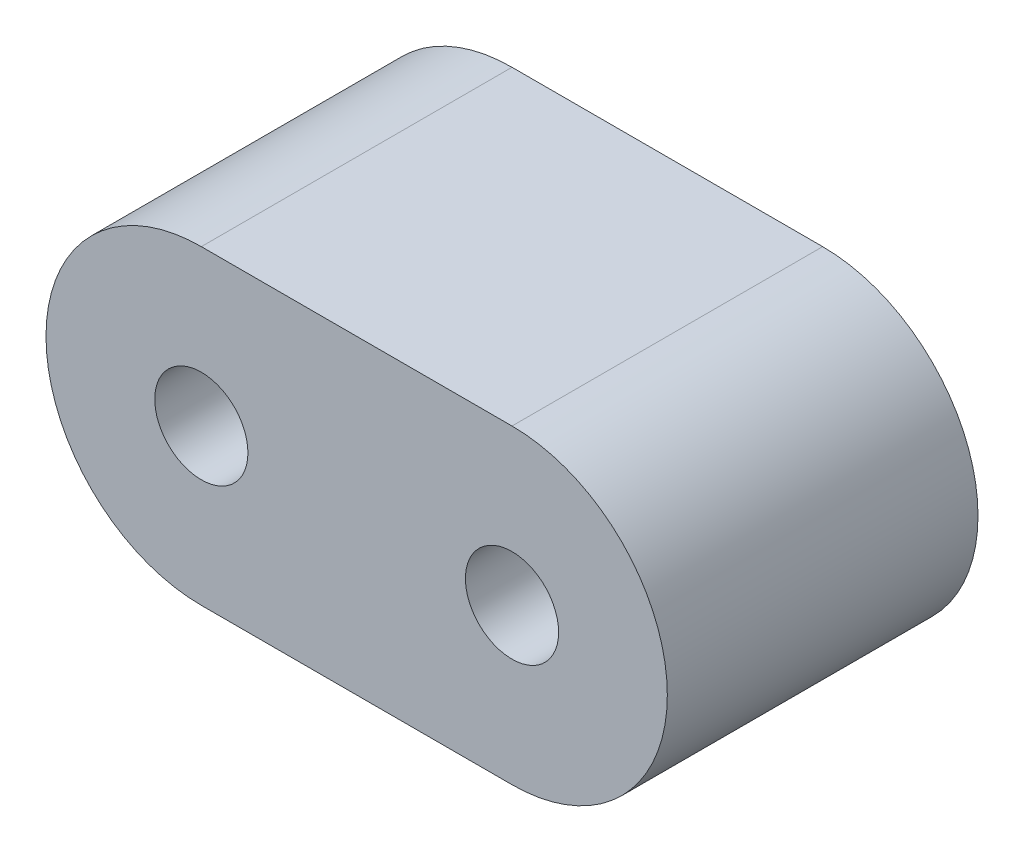
ISO-10303-21;
HEADER;
FILE_DESCRIPTION(('STEP AP214'),'2;1');
FILE_NAME('part.step','',(''),(''),'','','');
FILE_SCHEMA(('AUTOMOTIVE_DESIGN { 1 0 10303 214 1 1 1 1 }'));
ENDSEC;
DATA;
#1=APPLICATION_CONTEXT('core data for automotive mechanical design processes');
#2=APPLICATION_PROTOCOL_DEFINITION('international standard','automotive_design',2000,#1);
#3=PRODUCT_CONTEXT('',#1,'mechanical');
#4=PRODUCT('Part','Part','',(#3));
#5=PRODUCT_RELATED_PRODUCT_CATEGORY('part','',(#4));
#6=PRODUCT_DEFINITION_FORMATION('','',#4);
#7=PRODUCT_DEFINITION_CONTEXT('part definition',#1,'design');
#8=PRODUCT_DEFINITION('design','',#6,#7);
#9=PRODUCT_DEFINITION_SHAPE('','',#8);
#10=(LENGTH_UNIT() NAMED_UNIT(*) SI_UNIT(.MILLI.,.METRE.));
#11=(NAMED_UNIT(*) PLANE_ANGLE_UNIT() SI_UNIT($,.RADIAN.));
#12=(NAMED_UNIT(*) SI_UNIT($,.STERADIAN.) SOLID_ANGLE_UNIT());
#13=UNCERTAINTY_MEASURE_WITH_UNIT(LENGTH_MEASURE(1.E-05),#10,'distance_accuracy_value','');
#14=(GEOMETRIC_REPRESENTATION_CONTEXT(3) GLOBAL_UNCERTAINTY_ASSIGNED_CONTEXT((#13)) GLOBAL_UNIT_ASSIGNED_CONTEXT((#10,
#11,#12)) REPRESENTATION_CONTEXT('',''));
#15=CARTESIAN_POINT('',(0.,0.,0.));
#16=DIRECTION('',(0.,0.,1.));
#17=DIRECTION('',(1.,0.,0.));
#18=AXIS2_PLACEMENT_3D('',#15,#16,#17);
#19=CARTESIAN_POINT('',(0.,0.,10.));
#20=DIRECTION('',(0.,0.,-1.));
#21=DIRECTION('',(-1.,0.,0.));
#22=AXIS2_PLACEMENT_3D('',#19,#20,#21);
#23=CYLINDRICAL_SURFACE('',#22,5.);
#24=CARTESIAN_POINT('',(0.,0.,0.));
#25=DIRECTION('',(0.,0.,1.));
#26=DIRECTION('',(1.,0.,0.));
#27=AXIS2_PLACEMENT_3D('',#24,#25,#26);
#28=CIRCLE('',#27,5.);
#29=CARTESIAN_POINT('',(0.,-5.,0.));
#30=VERTEX_POINT('',#29);
#31=CARTESIAN_POINT('',(0.,5.,0.));
#32=VERTEX_POINT('',#31);
#33=EDGE_CURVE('E97',#30,#32,#28,.T.);
#34=ORIENTED_EDGE('',*,*,#33,.T.);
#35=DIRECTION('',(0.,0.,-1.));
#36=VECTOR('',#35,1.);
#37=CARTESIAN_POINT('',(0.,5.,10.));
#38=LINE('',#37,#36);
#39=CARTESIAN_POINT('',(0.,5.,10.));
#40=VERTEX_POINT('',#39);
#41=EDGE_CURVE('E11',#40,#32,#38,.T.);
#42=ORIENTED_EDGE('',*,*,#41,.F.);
#43=CARTESIAN_POINT('',(0.,0.,10.));
#44=DIRECTION('',(0.,0.,1.));
#45=DIRECTION('',(1.,0.,0.));
#46=AXIS2_PLACEMENT_3D('',#43,#44,#45);
#47=CIRCLE('',#46,5.);
#48=CARTESIAN_POINT('',(0.,-5.,10.));
#49=VERTEX_POINT('',#48);
#50=EDGE_CURVE('E85',#49,#40,#47,.T.);
#51=ORIENTED_EDGE('',*,*,#50,.F.);
#52=DIRECTION('',(0.,0.,-1.));
#53=VECTOR('',#52,1.);
#54=CARTESIAN_POINT('',(0.,-5.,10.));
#55=LINE('',#54,#53);
#56=EDGE_CURVE('E93',#49,#30,#55,.T.);
#57=ORIENTED_EDGE('',*,*,#56,.T.);
#58=EDGE_LOOP('',(#34,#42,#51,#57));
#59=FACE_BOUND('',#58,.T.);
#60=ADVANCED_FACE('F34',(#59),#23,.T.);
#61=CARTESIAN_POINT('',(0.,5.,10.));
#62=DIRECTION('',(0.,-1.,0.));
#63=DIRECTION('',(0.,0.,-1.));
#64=AXIS2_PLACEMENT_3D('',#61,#62,#63);
#65=PLANE('',#64);
#66=DIRECTION('',(-1.,0.,0.));
#67=VECTOR('',#66,1.);
#68=CARTESIAN_POINT('',(0.,5.,0.));
#69=LINE('',#68,#67);
#70=CARTESIAN_POINT('',(-10.,5.,0.));
#71=VERTEX_POINT('',#70);
#72=EDGE_CURVE('E89',#32,#71,#69,.T.);
#73=ORIENTED_EDGE('',*,*,#72,.T.);
#74=DIRECTION('',(0.,0.,-1.));
#75=VECTOR('',#74,1.);
#76=CARTESIAN_POINT('',(-10.,5.,10.));
#77=LINE('',#76,#75);
#78=CARTESIAN_POINT('',(-10.,5.,10.));
#79=VERTEX_POINT('',#78);
#80=EDGE_CURVE('E42',#79,#71,#77,.T.);
#81=ORIENTED_EDGE('',*,*,#80,.F.);
#82=DIRECTION('',(-1.,0.,0.));
#83=VECTOR('',#82,1.);
#84=CARTESIAN_POINT('',(0.,5.,10.));
#85=LINE('',#84,#83);
#86=EDGE_CURVE('E80',#40,#79,#85,.T.);
#87=ORIENTED_EDGE('',*,*,#86,.F.);
#88=ORIENTED_EDGE('',*,*,#41,.T.);
#89=EDGE_LOOP('',(#73,#81,#87,#88));
#90=FACE_BOUND('',#89,.T.);
#91=ADVANCED_FACE('F88',(#90),#65,.F.);
#92=CARTESIAN_POINT('',(-10.,0.,10.));
#93=DIRECTION('',(0.,0.,-1.));
#94=DIRECTION('',(-1.,0.,0.));
#95=AXIS2_PLACEMENT_3D('',#92,#93,#94);
#96=CYLINDRICAL_SURFACE('',#95,5.);
#97=CARTESIAN_POINT('',(-10.,0.,0.));
#98=DIRECTION('',(0.,0.,1.));
#99=DIRECTION('',(1.,0.,0.));
#100=AXIS2_PLACEMENT_3D('',#97,#98,#99);
#101=CIRCLE('',#100,5.);
#102=CARTESIAN_POINT('',(-10.,-5.,0.));
#103=VERTEX_POINT('',#102);
#104=EDGE_CURVE('E67',#71,#103,#101,.T.);
#105=ORIENTED_EDGE('',*,*,#104,.T.);
#106=DIRECTION('',(0.,0.,-1.));
#107=VECTOR('',#106,1.);
#108=CARTESIAN_POINT('',(-10.,-5.,10.));
#109=LINE('',#108,#107);
#110=CARTESIAN_POINT('',(-10.,-5.,10.));
#111=VERTEX_POINT('',#110);
#112=EDGE_CURVE('E90',#111,#103,#109,.T.);
#113=ORIENTED_EDGE('',*,*,#112,.F.);
#114=CARTESIAN_POINT('',(-10.,0.,10.));
#115=DIRECTION('',(0.,0.,1.));
#116=DIRECTION('',(1.,0.,0.));
#117=AXIS2_PLACEMENT_3D('',#114,#115,#116);
#118=CIRCLE('',#117,5.);
#119=EDGE_CURVE('E83',#79,#111,#118,.T.);
#120=ORIENTED_EDGE('',*,*,#119,.F.);
#121=ORIENTED_EDGE('',*,*,#80,.T.);
#122=EDGE_LOOP('',(#105,#113,#120,#121));
#123=FACE_BOUND('',#122,.T.);
#124=ADVANCED_FACE('F91',(#123),#96,.T.);
#125=CARTESIAN_POINT('',(0.,-5.,10.));
#126=DIRECTION('',(0.,1.,0.));
#127=DIRECTION('',(0.,0.,1.));
#128=AXIS2_PLACEMENT_3D('',#125,#126,#127);
#129=PLANE('',#128);
#130=DIRECTION('',(1.,0.,0.));
#131=VECTOR('',#130,1.);
#132=CARTESIAN_POINT('',(0.,-5.,0.));
#133=LINE('',#132,#131);
#134=EDGE_CURVE('E73',#103,#30,#133,.T.);
#135=ORIENTED_EDGE('',*,*,#134,.T.);
#136=ORIENTED_EDGE('',*,*,#56,.F.);
#137=DIRECTION('',(1.,0.,0.));
#138=VECTOR('',#137,1.);
#139=CARTESIAN_POINT('',(0.,-5.,10.));
#140=LINE('',#139,#138);
#141=EDGE_CURVE('E50',#111,#49,#140,.T.);
#142=ORIENTED_EDGE('',*,*,#141,.F.);
#143=ORIENTED_EDGE('',*,*,#112,.T.);
#144=EDGE_LOOP('',(#135,#136,#142,#143));
#145=FACE_BOUND('',#144,.T.);
#146=ADVANCED_FACE('F105',(#145),#129,.F.);
#147=CARTESIAN_POINT('',(0.,0.,10.));
#148=DIRECTION('',(0.,0.,1.));
#149=DIRECTION('',(1.,0.,0.));
#150=AXIS2_PLACEMENT_3D('',#147,#148,#149);
#151=PLANE('',#150);
#152=CARTESIAN_POINT('',(0.,0.,10.));
#153=DIRECTION('',(0.,0.,1.));
#154=DIRECTION('',(1.,0.,0.));
#155=AXIS2_PLACEMENT_3D('',#152,#153,#154);
#156=CIRCLE('',#155,1.5);
#157=CARTESIAN_POINT('',(1.5,0.,10.));
#158=VERTEX_POINT('',#157);
#159=EDGE_CURVE('E117',#158,#158,#156,.T.);
#160=ORIENTED_EDGE('',*,*,#159,.F.);
#161=EDGE_LOOP('',(#160));
#162=FACE_BOUND('',#161,.T.);
#163=CARTESIAN_POINT('',(-10.,0.,10.));
#164=DIRECTION('',(0.,0.,1.));
#165=DIRECTION('',(1.,0.,0.));
#166=AXIS2_PLACEMENT_3D('',#163,#164,#165);
#167=CIRCLE('',#166,1.5);
#168=CARTESIAN_POINT('',(-8.5,0.,10.));
#169=VERTEX_POINT('',#168);
#170=EDGE_CURVE('E111',#169,#169,#167,.T.);
#171=ORIENTED_EDGE('',*,*,#170,.F.);
#172=EDGE_LOOP('',(#171));
#173=FACE_BOUND('',#172,.T.);
#174=ORIENTED_EDGE('',*,*,#50,.T.);
#175=ORIENTED_EDGE('',*,*,#86,.T.);
#176=ORIENTED_EDGE('',*,*,#119,.T.);
#177=ORIENTED_EDGE('',*,*,#141,.T.);
#178=EDGE_LOOP('',(#174,#175,#176,#177));
#179=FACE_BOUND('',#178,.T.);
#180=ADVANCED_FACE('F81',(#162,#173,#179),#151,.T.);
#181=CARTESIAN_POINT('',(0.,0.,0.));
#182=DIRECTION('',(0.,0.,1.));
#183=DIRECTION('',(1.,0.,0.));
#184=AXIS2_PLACEMENT_3D('',#181,#182,#183);
#185=PLANE('',#184);
#186=CARTESIAN_POINT('',(0.,0.,0.));
#187=DIRECTION('',(0.,0.,1.));
#188=DIRECTION('',(1.,0.,0.));
#189=AXIS2_PLACEMENT_3D('',#186,#187,#188);
#190=CIRCLE('',#189,1.5);
#191=CARTESIAN_POINT('',(1.5,0.,0.));
#192=VERTEX_POINT('',#191);
#193=EDGE_CURVE('E100',#192,#192,#190,.T.);
#194=ORIENTED_EDGE('',*,*,#193,.T.);
#195=EDGE_LOOP('',(#194));
#196=FACE_BOUND('',#195,.T.);
#197=CARTESIAN_POINT('',(-10.,0.,0.));
#198=DIRECTION('',(0.,0.,1.));
#199=DIRECTION('',(1.,0.,0.));
#200=AXIS2_PLACEMENT_3D('',#197,#198,#199);
#201=CIRCLE('',#200,1.5);
#202=CARTESIAN_POINT('',(-8.5,0.,0.));
#203=VERTEX_POINT('',#202);
#204=EDGE_CURVE('E114',#203,#203,#201,.T.);
#205=ORIENTED_EDGE('',*,*,#204,.T.);
#206=EDGE_LOOP('',(#205));
#207=FACE_BOUND('',#206,.T.);
#208=ORIENTED_EDGE('',*,*,#33,.F.);
#209=ORIENTED_EDGE('',*,*,#134,.F.);
#210=ORIENTED_EDGE('',*,*,#104,.F.);
#211=ORIENTED_EDGE('',*,*,#72,.F.);
#212=EDGE_LOOP('',(#208,#209,#210,#211));
#213=FACE_BOUND('',#212,.T.);
#214=ADVANCED_FACE('F108',(#196,#207,#213),#185,.F.);
#215=CARTESIAN_POINT('',(-10.,0.,0.));
#216=DIRECTION('',(0.,0.,1.));
#217=DIRECTION('',(1.,0.,0.));
#218=AXIS2_PLACEMENT_3D('',#215,#216,#217);
#219=CYLINDRICAL_SURFACE('',#218,1.5);
#220=ORIENTED_EDGE('',*,*,#204,.F.);
#221=EDGE_LOOP('',(#220));
#222=FACE_BOUND('',#221,.T.);
#223=ORIENTED_EDGE('',*,*,#170,.T.);
#224=EDGE_LOOP('',(#223));
#225=FACE_BOUND('',#224,.T.);
#226=ADVANCED_FACE('F128',(#222,#225),#219,.F.);
#227=CARTESIAN_POINT('',(0.,0.,0.));
#228=DIRECTION('',(0.,0.,1.));
#229=DIRECTION('',(1.,0.,0.));
#230=AXIS2_PLACEMENT_3D('',#227,#228,#229);
#231=CYLINDRICAL_SURFACE('',#230,1.5);
#232=ORIENTED_EDGE('',*,*,#193,.F.);
#233=EDGE_LOOP('',(#232));
#234=FACE_BOUND('',#233,.T.);
#235=ORIENTED_EDGE('',*,*,#159,.T.);
#236=EDGE_LOOP('',(#235));
#237=FACE_BOUND('',#236,.T.);
#238=ADVANCED_FACE('F125',(#234,#237),#231,.F.);
#239=CLOSED_SHELL('',(#60,#91,#124,#146,#180,#214,#226,#238));
#240=MANIFOLD_SOLID_BREP('B2',#239);
#241=ADVANCED_BREP_SHAPE_REPRESENTATION('',(#18,#240),#14);
#242=SHAPE_DEFINITION_REPRESENTATION(#9,#241);
ENDSEC;
END-ISO-10303-21;
